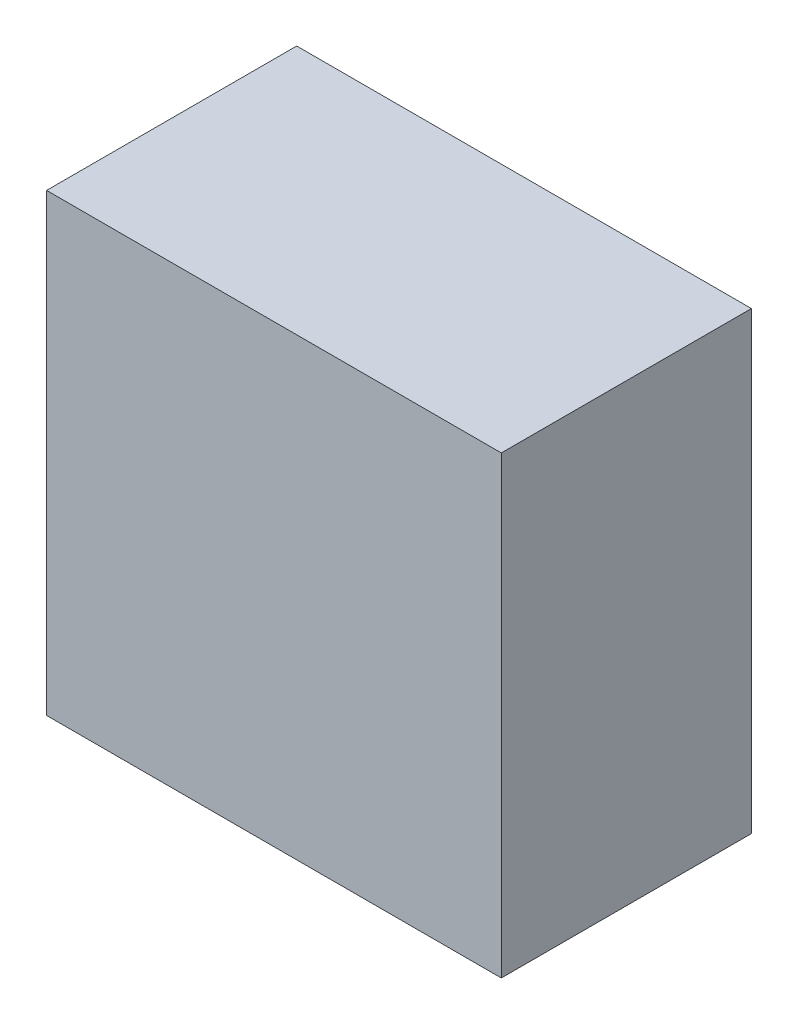
ISO-10303-21;
HEADER;
FILE_DESCRIPTION(('STEP AP214'),'2;1');
FILE_NAME('part.step','',(''),(''),'','','');
FILE_SCHEMA(('AUTOMOTIVE_DESIGN { 1 0 10303 214 1 1 1 1 }'));
ENDSEC;
DATA;
#1=APPLICATION_CONTEXT('core data for automotive mechanical design processes');
#2=APPLICATION_PROTOCOL_DEFINITION('international standard','automotive_design',2000,#1);
#3=PRODUCT_CONTEXT('',#1,'mechanical');
#4=PRODUCT('Part','Part','',(#3));
#5=PRODUCT_RELATED_PRODUCT_CATEGORY('part','',(#4));
#6=PRODUCT_DEFINITION_FORMATION('','',#4);
#7=PRODUCT_DEFINITION_CONTEXT('part definition',#1,'design');
#8=PRODUCT_DEFINITION('design','',#6,#7);
#9=PRODUCT_DEFINITION_SHAPE('','',#8);
#10=(LENGTH_UNIT() NAMED_UNIT(*) SI_UNIT(.MILLI.,.METRE.));
#11=(NAMED_UNIT(*) PLANE_ANGLE_UNIT() SI_UNIT($,.RADIAN.));
#12=(NAMED_UNIT(*) SI_UNIT($,.STERADIAN.) SOLID_ANGLE_UNIT());
#13=UNCERTAINTY_MEASURE_WITH_UNIT(LENGTH_MEASURE(1.E-05),#10,'distance_accuracy_value','');
#14=(GEOMETRIC_REPRESENTATION_CONTEXT(3) GLOBAL_UNCERTAINTY_ASSIGNED_CONTEXT((#13)) GLOBAL_UNIT_ASSIGNED_CONTEXT((#10,
#11,#12)) REPRESENTATION_CONTEXT('',''));
#15=CARTESIAN_POINT('',(0.,0.,0.));
#16=DIRECTION('',(0.,0.,1.));
#17=DIRECTION('',(1.,0.,0.));
#18=AXIS2_PLACEMENT_3D('',#15,#16,#17);
#19=CARTESIAN_POINT('',(-0.2999994,-0.2999994,0.32999934));
#20=DIRECTION('',(0.,0.,-1.));
#21=DIRECTION('',(0.,-1.,0.));
#22=AXIS2_PLACEMENT_3D('',#19,#20,#21);
#23=PLANE('',#22);
#24=DIRECTION('',(1.,0.,0.));
#25=VECTOR('',#24,1.);
#26=CARTESIAN_POINT('',(-0.2999994,-0.2999994,0.32999934));
#27=LINE('',#26,#25);
#28=CARTESIAN_POINT('',(-0.2999994,-0.2999994,0.32999934));
#29=VERTEX_POINT('',#28);
#30=CARTESIAN_POINT('',(0.2999994,-0.2999994,0.32999934));
#31=VERTEX_POINT('',#30);
#32=EDGE_CURVE('E96',#29,#31,#27,.T.);
#33=ORIENTED_EDGE('',*,*,#32,.T.);
#34=DIRECTION('',(0.,1.,0.));
#35=VECTOR('',#34,1.);
#36=CARTESIAN_POINT('',(0.2999994,-0.2999994,0.32999934));
#37=LINE('',#36,#35);
#38=CARTESIAN_POINT('',(0.2999994,0.30000194,0.32999934));
#39=VERTEX_POINT('',#38);
#40=EDGE_CURVE('E75',#31,#39,#37,.T.);
#41=ORIENTED_EDGE('',*,*,#40,.T.);
#42=DIRECTION('',(-1.,0.,0.));
#43=VECTOR('',#42,1.);
#44=CARTESIAN_POINT('',(0.2999994,0.30000194,0.32999934));
#45=LINE('',#44,#43);
#46=CARTESIAN_POINT('',(-0.2999994,0.30000194,0.32999934));
#47=VERTEX_POINT('',#46);
#48=EDGE_CURVE('E80',#39,#47,#45,.T.);
#49=ORIENTED_EDGE('',*,*,#48,.T.);
#50=DIRECTION('',(0.,-1.,0.));
#51=VECTOR('',#50,1.);
#52=CARTESIAN_POINT('',(-0.2999994,0.30000194,0.32999934));
#53=LINE('',#52,#51);
#54=EDGE_CURVE('E11',#47,#29,#53,.T.);
#55=ORIENTED_EDGE('',*,*,#54,.T.);
#56=EDGE_LOOP('',(#33,#41,#49,#55));
#57=FACE_BOUND('',#56,.T.);
#58=ADVANCED_FACE('F16',(#57),#23,.F.);
#59=CARTESIAN_POINT('',(-0.2999994,-0.2999994,0.));
#60=DIRECTION('',(0.,0.,-1.));
#61=DIRECTION('',(0.,-1.,0.));
#62=AXIS2_PLACEMENT_3D('',#59,#60,#61);
#63=PLANE('',#62);
#64=DIRECTION('',(0.,-1.,0.));
#65=VECTOR('',#64,1.);
#66=CARTESIAN_POINT('',(-0.2999994,0.30000194,0.));
#67=LINE('',#66,#65);
#68=CARTESIAN_POINT('',(-0.2999994,0.30000194,0.));
#69=VERTEX_POINT('',#68);
#70=CARTESIAN_POINT('',(-0.2999994,-0.2999994,0.));
#71=VERTEX_POINT('',#70);
#72=EDGE_CURVE('E27',#69,#71,#67,.T.);
#73=ORIENTED_EDGE('',*,*,#72,.F.);
#74=DIRECTION('',(-1.,0.,0.));
#75=VECTOR('',#74,1.);
#76=CARTESIAN_POINT('',(0.2999994,0.30000194,0.));
#77=LINE('',#76,#75);
#78=CARTESIAN_POINT('',(0.2999994,0.30000194,0.));
#79=VERTEX_POINT('',#78);
#80=EDGE_CURVE('E65',#79,#69,#77,.T.);
#81=ORIENTED_EDGE('',*,*,#80,.F.);
#82=DIRECTION('',(0.,1.,0.));
#83=VECTOR('',#82,1.);
#84=CARTESIAN_POINT('',(0.2999994,-0.2999994,0.));
#85=LINE('',#84,#83);
#86=CARTESIAN_POINT('',(0.2999994,-0.2999994,0.));
#87=VERTEX_POINT('',#86);
#88=EDGE_CURVE('E70',#87,#79,#85,.T.);
#89=ORIENTED_EDGE('',*,*,#88,.F.);
#90=DIRECTION('',(1.,0.,0.));
#91=VECTOR('',#90,1.);
#92=CARTESIAN_POINT('',(-0.2999994,-0.2999994,0.));
#93=LINE('',#92,#91);
#94=EDGE_CURVE('E103',#71,#87,#93,.T.);
#95=ORIENTED_EDGE('',*,*,#94,.F.);
#96=EDGE_LOOP('',(#73,#81,#89,#95));
#97=FACE_BOUND('',#96,.T.);
#98=ADVANCED_FACE('F67',(#97),#63,.T.);
#99=CARTESIAN_POINT('',(-0.2999994,0.30000194,0.));
#100=DIRECTION('',(1.,0.,0.));
#101=DIRECTION('',(0.,1.,0.));
#102=AXIS2_PLACEMENT_3D('',#99,#100,#101);
#103=PLANE('',#102);
#104=ORIENTED_EDGE('',*,*,#72,.T.);
#105=DIRECTION('',(0.,0.,1.));
#106=VECTOR('',#105,1.);
#107=CARTESIAN_POINT('',(-0.2999994,-0.2999994,0.));
#108=LINE('',#107,#106);
#109=EDGE_CURVE('E90',#71,#29,#108,.T.);
#110=ORIENTED_EDGE('',*,*,#109,.T.);
#111=ORIENTED_EDGE('',*,*,#54,.F.);
#112=DIRECTION('',(0.,0.,1.));
#113=VECTOR('',#112,1.);
#114=CARTESIAN_POINT('',(-0.2999994,0.30000194,0.));
#115=LINE('',#114,#113);
#116=EDGE_CURVE('E20',#69,#47,#115,.T.);
#117=ORIENTED_EDGE('',*,*,#116,.F.);
#118=EDGE_LOOP('',(#104,#110,#111,#117));
#119=FACE_BOUND('',#118,.T.);
#120=ADVANCED_FACE('F119',(#119),#103,.F.);
#121=CARTESIAN_POINT('',(0.2999994,0.30000194,0.));
#122=DIRECTION('',(0.,-1.,0.));
#123=DIRECTION('',(0.,0.,-1.));
#124=AXIS2_PLACEMENT_3D('',#121,#122,#123);
#125=PLANE('',#124);
#126=ORIENTED_EDGE('',*,*,#80,.T.);
#127=ORIENTED_EDGE('',*,*,#116,.T.);
#128=ORIENTED_EDGE('',*,*,#48,.F.);
#129=DIRECTION('',(0.,0.,1.));
#130=VECTOR('',#129,1.);
#131=CARTESIAN_POINT('',(0.2999994,0.30000194,0.));
#132=LINE('',#131,#130);
#133=EDGE_CURVE('E78',#79,#39,#132,.T.);
#134=ORIENTED_EDGE('',*,*,#133,.F.);
#135=EDGE_LOOP('',(#126,#127,#128,#134));
#136=FACE_BOUND('',#135,.T.);
#137=ADVANCED_FACE('F79',(#136),#125,.F.);
#138=CARTESIAN_POINT('',(0.2999994,-0.2999994,0.));
#139=DIRECTION('',(-1.,0.,0.));
#140=DIRECTION('',(0.,0.,1.));
#141=AXIS2_PLACEMENT_3D('',#138,#139,#140);
#142=PLANE('',#141);
#143=ORIENTED_EDGE('',*,*,#88,.T.);
#144=ORIENTED_EDGE('',*,*,#133,.T.);
#145=ORIENTED_EDGE('',*,*,#40,.F.);
#146=DIRECTION('',(0.,0.,1.));
#147=VECTOR('',#146,1.);
#148=CARTESIAN_POINT('',(0.2999994,-0.2999994,0.));
#149=LINE('',#148,#147);
#150=EDGE_CURVE('E87',#87,#31,#149,.T.);
#151=ORIENTED_EDGE('',*,*,#150,.F.);
#152=EDGE_LOOP('',(#143,#144,#145,#151));
#153=FACE_BOUND('',#152,.T.);
#154=ADVANCED_FACE('F18',(#153),#142,.F.);
#155=CARTESIAN_POINT('',(-0.2999994,-0.2999994,0.));
#156=DIRECTION('',(0.,1.,0.));
#157=DIRECTION('',(1.,0.,0.));
#158=AXIS2_PLACEMENT_3D('',#155,#156,#157);
#159=PLANE('',#158);
#160=ORIENTED_EDGE('',*,*,#94,.T.);
#161=ORIENTED_EDGE('',*,*,#150,.T.);
#162=ORIENTED_EDGE('',*,*,#32,.F.);
#163=ORIENTED_EDGE('',*,*,#109,.F.);
#164=EDGE_LOOP('',(#160,#161,#162,#163));
#165=FACE_BOUND('',#164,.T.);
#166=ADVANCED_FACE('F118',(#165),#159,.F.);
#167=CLOSED_SHELL('',(#58,#98,#120,#137,#154,#166));
#168=MANIFOLD_SOLID_BREP('B1',#167);
#169=ADVANCED_BREP_SHAPE_REPRESENTATION('',(#18,#168),#14);
#170=SHAPE_DEFINITION_REPRESENTATION(#9,#169);
ENDSEC;
END-ISO-10303-21;
